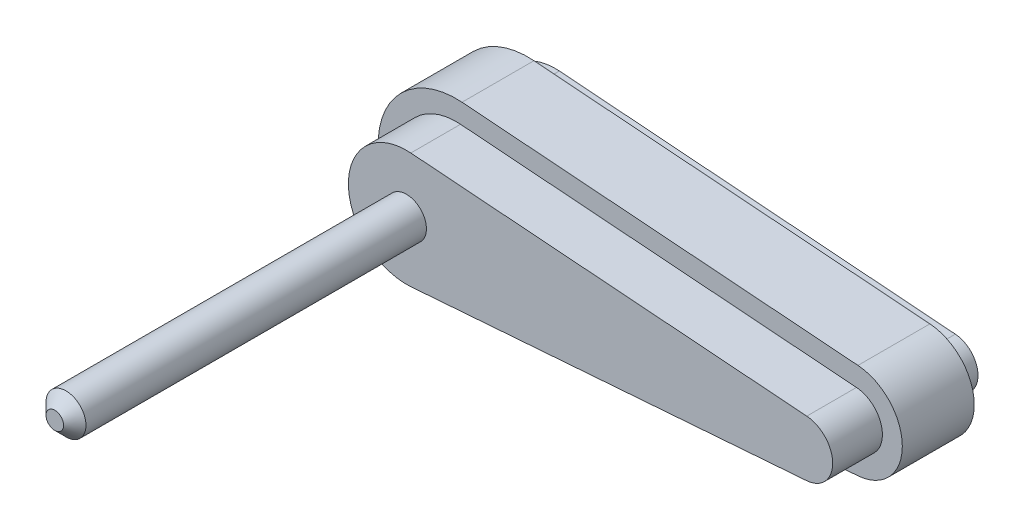
ISO-10303-21;
HEADER;
FILE_DESCRIPTION(('STEP AP214'),'2;1');
FILE_NAME('part.step','',(''),(''),'','','');
FILE_SCHEMA(('AUTOMOTIVE_DESIGN { 1 0 10303 214 1 1 1 1 }'));
ENDSEC;
DATA;
#1=APPLICATION_CONTEXT('core data for automotive mechanical design processes');
#2=APPLICATION_PROTOCOL_DEFINITION('international standard','automotive_design',2000,#1);
#3=PRODUCT_CONTEXT('',#1,'mechanical');
#4=PRODUCT('Part','Part','',(#3));
#5=PRODUCT_RELATED_PRODUCT_CATEGORY('part','',(#4));
#6=PRODUCT_DEFINITION_FORMATION('','',#4);
#7=PRODUCT_DEFINITION_CONTEXT('part definition',#1,'design');
#8=PRODUCT_DEFINITION('design','',#6,#7);
#9=PRODUCT_DEFINITION_SHAPE('','',#8);
#10=(LENGTH_UNIT() NAMED_UNIT(*) SI_UNIT(.MILLI.,.METRE.));
#11=(NAMED_UNIT(*) PLANE_ANGLE_UNIT() SI_UNIT($,.RADIAN.));
#12=(NAMED_UNIT(*) SI_UNIT($,.STERADIAN.) SOLID_ANGLE_UNIT());
#13=UNCERTAINTY_MEASURE_WITH_UNIT(LENGTH_MEASURE(1.E-05),#10,'distance_accuracy_value','');
#14=(GEOMETRIC_REPRESENTATION_CONTEXT(3) GLOBAL_UNCERTAINTY_ASSIGNED_CONTEXT((#13)) GLOBAL_UNIT_ASSIGNED_CONTEXT((#10,
#11,#12)) REPRESENTATION_CONTEXT('',''));
#15=CARTESIAN_POINT('',(0.,0.,0.));
#16=DIRECTION('',(0.,0.,1.));
#17=DIRECTION('',(1.,0.,0.));
#18=AXIS2_PLACEMENT_3D('',#15,#16,#17);
#19=CARTESIAN_POINT('',(0.,0.,-23.6474));
#20=DIRECTION('',(0.,0.,1.));
#21=DIRECTION('',(1.,0.,0.));
#22=AXIS2_PLACEMENT_3D('',#19,#20,#21);
#23=CYLINDRICAL_SURFACE('',#22,9.22655);
#24=DIRECTION('',(0.,0.,1.));
#25=VECTOR('',#24,1.);
#26=CARTESIAN_POINT('',(0.695350686279332,9.20031044723986,-23.6474));
#27=LINE('',#26,#25);
#28=CARTESIAN_POINT('',(0.695350686279328,9.20031044723986,-7.8994));
#29=VERTEX_POINT('',#28);
#30=CARTESIAN_POINT('',(0.695350686279332,9.20031044723986,0.));
#31=VERTEX_POINT('',#30);
#32=EDGE_CURVE('E220',#29,#31,#27,.T.);
#33=ORIENTED_EDGE('',*,*,#32,.F.);
#34=CARTESIAN_POINT('',(0.,0.,-7.8994));
#35=DIRECTION('',(0.,0.,-1.));
#36=DIRECTION('',(-1.,0.,0.));
#37=AXIS2_PLACEMENT_3D('',#34,#35,#36);
#38=CIRCLE('',#37,9.22655);
#39=CARTESIAN_POINT('',(0.69535068627933,-9.20031044723986,-7.8994));
#40=VERTEX_POINT('',#39);
#41=EDGE_CURVE('E192',#40,#29,#38,.T.);
#42=ORIENTED_EDGE('',*,*,#41,.F.);
#43=DIRECTION('',(0.,0.,1.));
#44=VECTOR('',#43,1.);
#45=CARTESIAN_POINT('',(0.695350686279332,-9.20031044723986,-23.6474));
#46=LINE('',#45,#44);
#47=CARTESIAN_POINT('',(0.695350686279332,-9.20031044723986,0.));
#48=VERTEX_POINT('',#47);
#49=EDGE_CURVE('E219',#40,#48,#46,.T.);
#50=ORIENTED_EDGE('',*,*,#49,.T.);
#51=CARTESIAN_POINT('',(0.,0.,0.));
#52=DIRECTION('',(0.,0.,1.));
#53=DIRECTION('',(1.,0.,0.));
#54=AXIS2_PLACEMENT_3D('',#51,#52,#53);
#55=CIRCLE('',#54,9.22655);
#56=EDGE_CURVE('E207',#31,#48,#55,.T.);
#57=ORIENTED_EDGE('',*,*,#56,.F.);
#58=EDGE_LOOP('',(#33,#42,#50,#57));
#59=FACE_BOUND('',#58,.T.);
#60=ADVANCED_FACE('F37',(#59),#23,.T.);
#61=CARTESIAN_POINT('',(0.695350686279332,9.20031044723986,-23.6474));
#62=DIRECTION('',(0.0753641053567512,0.997156081876742,0.));
#63=DIRECTION('',(-0.997156081876742,0.0753641053567512,0.));
#64=AXIS2_PLACEMENT_3D('',#61,#62,#63);
#65=PLANE('',#64);
#66=DIRECTION('',(0.,0.,1.));
#67=VECTOR('',#66,1.);
#68=CARTESIAN_POINT('',(63.6137215901869,4.445,-23.6474));
#69=LINE('',#68,#67);
#70=CARTESIAN_POINT('',(63.6137215901869,4.445,-7.8994));
#71=VERTEX_POINT('',#70);
#72=CARTESIAN_POINT('',(63.6137215901869,4.445,0.));
#73=VERTEX_POINT('',#72);
#74=EDGE_CURVE('E222',#71,#73,#69,.T.);
#75=ORIENTED_EDGE('',*,*,#74,.F.);
#76=DIRECTION('',(0.997156081876742,-0.0753641053567512,0.));
#77=VECTOR('',#76,1.);
#78=CARTESIAN_POINT('',(0.695350686279328,9.20031044723986,-7.8994));
#79=LINE('',#78,#77);
#80=EDGE_CURVE('E198',#29,#71,#79,.T.);
#81=ORIENTED_EDGE('',*,*,#80,.F.);
#82=ORIENTED_EDGE('',*,*,#32,.T.);
#83=DIRECTION('',(-0.997156081876742,0.0753641053567512,0.));
#84=VECTOR('',#83,1.);
#85=CARTESIAN_POINT('',(0.695350686279332,9.20031044723986,0.));
#86=LINE('',#85,#84);
#87=EDGE_CURVE('E216',#73,#31,#86,.T.);
#88=ORIENTED_EDGE('',*,*,#87,.F.);
#89=EDGE_LOOP('',(#75,#81,#82,#88));
#90=FACE_BOUND('',#89,.T.);
#91=ADVANCED_FACE('F240',(#90),#65,.T.);
#92=CARTESIAN_POINT('',(63.2777727308265,0.,-23.6474));
#93=DIRECTION('',(0.,0.,1.));
#94=DIRECTION('',(1.,0.,0.));
#95=AXIS2_PLACEMENT_3D('',#92,#93,#94);
#96=CYLINDRICAL_SURFACE('',#95,4.45767726917343);
#97=DIRECTION('',(0.,0.,1.));
#98=VECTOR('',#97,1.);
#99=CARTESIAN_POINT('',(63.6137215901869,-4.445,-23.6474));
#100=LINE('',#99,#98);
#101=CARTESIAN_POINT('',(63.6137215901869,-4.445,-7.8994));
#102=VERTEX_POINT('',#101);
#103=CARTESIAN_POINT('',(63.6137215901869,-4.445,0.));
#104=VERTEX_POINT('',#103);
#105=EDGE_CURVE('E224',#102,#104,#100,.T.);
#106=ORIENTED_EDGE('',*,*,#105,.F.);
#107=CARTESIAN_POINT('',(63.2777727308265,0.,-7.8994));
#108=DIRECTION('',(0.,0.,-1.));
#109=DIRECTION('',(-1.,0.,0.));
#110=AXIS2_PLACEMENT_3D('',#107,#108,#109);
#111=CIRCLE('',#110,4.45767726917343);
#112=EDGE_CURVE('E201',#71,#102,#111,.T.);
#113=ORIENTED_EDGE('',*,*,#112,.F.);
#114=ORIENTED_EDGE('',*,*,#74,.T.);
#115=CARTESIAN_POINT('',(63.2777727308265,0.,0.));
#116=DIRECTION('',(0.,0.,1.));
#117=DIRECTION('',(-1.,0.,0.));
#118=AXIS2_PLACEMENT_3D('',#115,#116,#117);
#119=CIRCLE('',#118,4.45767726917343);
#120=EDGE_CURVE('E213',#104,#73,#119,.T.);
#121=ORIENTED_EDGE('',*,*,#120,.F.);
#122=EDGE_LOOP('',(#106,#113,#114,#121));
#123=FACE_BOUND('',#122,.T.);
#124=ADVANCED_FACE('F245',(#123),#96,.T.);
#125=CARTESIAN_POINT('',(0.695350686279332,-9.20031044723986,-23.6474));
#126=DIRECTION('',(0.0753641053567512,-0.997156081876742,0.));
#127=DIRECTION('',(0.997156081876742,0.0753641053567512,0.));
#128=AXIS2_PLACEMENT_3D('',#125,#126,#127);
#129=PLANE('',#128);
#130=ORIENTED_EDGE('',*,*,#49,.F.);
#131=DIRECTION('',(-0.997156081876742,-0.0753641053567512,0.));
#132=VECTOR('',#131,1.);
#133=CARTESIAN_POINT('',(63.6137215901869,-4.445,-7.8994));
#134=LINE('',#133,#132);
#135=EDGE_CURVE('E204',#102,#40,#134,.T.);
#136=ORIENTED_EDGE('',*,*,#135,.F.);
#137=ORIENTED_EDGE('',*,*,#105,.T.);
#138=DIRECTION('',(0.997156081876742,0.0753641053567512,0.));
#139=VECTOR('',#138,1.);
#140=CARTESIAN_POINT('',(0.695350686279332,-9.20031044723986,0.));
#141=LINE('',#140,#139);
#142=EDGE_CURVE('E210',#48,#104,#141,.T.);
#143=ORIENTED_EDGE('',*,*,#142,.F.);
#144=EDGE_LOOP('',(#130,#136,#137,#143));
#145=FACE_BOUND('',#144,.T.);
#146=ADVANCED_FACE('F250',(#145),#129,.T.);
#147=CARTESIAN_POINT('',(0.,0.,0.));
#148=DIRECTION('',(0.,0.,1.));
#149=DIRECTION('',(1.,0.,0.));
#150=AXIS2_PLACEMENT_3D('',#147,#148,#149);
#151=PLANE('',#150);
#152=CARTESIAN_POINT('',(0.,0.,0.));
#153=DIRECTION('',(0.,0.,1.));
#154=DIRECTION('',(1.,0.,0.));
#155=AXIS2_PLACEMENT_3D('',#152,#153,#154);
#156=CIRCLE('',#155,3.175);
#157=CARTESIAN_POINT('',(3.175,0.,0.));
#158=VERTEX_POINT('',#157);
#159=EDGE_CURVE('E180',#158,#158,#156,.T.);
#160=ORIENTED_EDGE('',*,*,#159,.F.);
#161=EDGE_LOOP('',(#160));
#162=FACE_BOUND('',#161,.T.);
#163=ORIENTED_EDGE('',*,*,#56,.T.);
#164=ORIENTED_EDGE('',*,*,#142,.T.);
#165=ORIENTED_EDGE('',*,*,#120,.T.);
#166=ORIENTED_EDGE('',*,*,#87,.T.);
#167=EDGE_LOOP('',(#163,#164,#165,#166));
#168=FACE_BOUND('',#167,.T.);
#169=ADVANCED_FACE('F253',(#162,#168),#151,.T.);
#170=CARTESIAN_POINT('',(0.,0.,55.88));
#171=DIRECTION('',(0.,0.,-1.));
#172=DIRECTION('',(-1.,0.,0.));
#173=AXIS2_PLACEMENT_3D('',#170,#171,#172);
#174=CYLINDRICAL_SURFACE('',#173,3.175);
#175=CARTESIAN_POINT('',(0.,0.,54.102));
#176=DIRECTION('',(0.,0.,1.));
#177=DIRECTION('',(1.,0.,0.));
#178=AXIS2_PLACEMENT_3D('',#175,#176,#177);
#179=CIRCLE('',#178,3.175);
#180=CARTESIAN_POINT('',(3.175,0.,54.102));
#181=VERTEX_POINT('',#180);
#182=EDGE_CURVE('E11',#181,#181,#179,.F.);
#183=ORIENTED_EDGE('',*,*,#182,.T.);
#184=EDGE_LOOP('',(#183));
#185=FACE_BOUND('',#184,.T.);
#186=ORIENTED_EDGE('',*,*,#159,.T.);
#187=EDGE_LOOP('',(#186));
#188=FACE_BOUND('',#187,.T.);
#189=ADVANCED_FACE('F260',(#185,#188),#174,.T.);
#190=CARTESIAN_POINT('',(0.,0.,55.88));
#191=DIRECTION('',(0.,0.,1.));
#192=DIRECTION('',(1.,0.,0.));
#193=AXIS2_PLACEMENT_3D('',#190,#191,#192);
#194=PLANE('',#193);
#195=CARTESIAN_POINT('',(0.,0.,55.88));
#196=DIRECTION('',(0.,0.,1.));
#197=DIRECTION('',(1.,0.,0.));
#198=AXIS2_PLACEMENT_3D('',#195,#196,#197);
#199=CIRCLE('',#198,1.39699999999998);
#200=CARTESIAN_POINT('',(1.39699999999998,0.,55.88));
#201=VERTEX_POINT('',#200);
#202=EDGE_CURVE('E45',#201,#201,#199,.T.);
#203=ORIENTED_EDGE('',*,*,#202,.T.);
#204=EDGE_LOOP('',(#203));
#205=FACE_BOUND('',#204,.T.);
#206=ADVANCED_FACE('F229',(#205),#194,.T.);
#207=CARTESIAN_POINT('',(0.,0.,-19.3294));
#208=DIRECTION('',(0.,0.,-1.));
#209=DIRECTION('',(-1.,0.,0.));
#210=AXIS2_PLACEMENT_3D('',#207,#208,#209);
#211=PLANE('',#210);
#212=CARTESIAN_POINT('',(0.,0.,-19.3294));
#213=DIRECTION('',(0.,0.,-1.));
#214=DIRECTION('',(-1.,0.,0.));
#215=AXIS2_PLACEMENT_3D('',#212,#213,#214);
#216=CIRCLE('',#215,12.38885);
#217=CARTESIAN_POINT('',(0.933674596649023,-12.3536171249587,-19.3294));
#218=VERTEX_POINT('',#217);
#219=CARTESIAN_POINT('',(0.933674596648987,12.3536171249587,-19.3294));
#220=VERTEX_POINT('',#219);
#221=EDGE_CURVE('E151',#218,#220,#216,.T.);
#222=ORIENTED_EDGE('',*,*,#221,.T.);
#223=DIRECTION('',(0.997156081876742,-0.0753641053567512,0.));
#224=VECTOR('',#223,1.);
#225=CARTESIAN_POINT('',(0.933674596648987,12.3536171249587,-19.3294));
#226=LINE('',#225,#224);
#227=CARTESIAN_POINT('',(63.8520455005565,7.59830667771882,-19.3294));
#228=VERTEX_POINT('',#227);
#229=EDGE_CURVE('E154',#220,#228,#226,.T.);
#230=ORIENTED_EDGE('',*,*,#229,.T.);
#231=CARTESIAN_POINT('',(63.2777727308265,0.,-19.3294));
#232=DIRECTION('',(0.,0.,-1.));
#233=DIRECTION('',(-1.,0.,0.));
#234=AXIS2_PLACEMENT_3D('',#231,#232,#233);
#235=CIRCLE('',#234,7.61997726917343);
#236=CARTESIAN_POINT('',(63.8520455005566,-7.59830667771882,-19.3294));
#237=VERTEX_POINT('',#236);
#238=EDGE_CURVE('E157',#228,#237,#235,.T.);
#239=ORIENTED_EDGE('',*,*,#238,.T.);
#240=DIRECTION('',(-0.997156081876742,-0.0753641053567512,0.));
#241=VECTOR('',#240,1.);
#242=CARTESIAN_POINT('',(63.8520455005566,-7.59830667771882,-19.3294));
#243=LINE('',#242,#241);
#244=EDGE_CURVE('E159',#237,#218,#243,.T.);
#245=ORIENTED_EDGE('',*,*,#244,.T.);
#246=EDGE_LOOP('',(#222,#230,#239,#245));
#247=FACE_BOUND('',#246,.T.);
#248=DIRECTION('',(0.997156081876742,-0.0753641053567512,0.));
#249=VECTOR('',#248,1.);
#250=CARTESIAN_POINT('',(0.653237224205975,8.64309962868714,-19.3294));
#251=LINE('',#250,#249);
#252=CARTESIAN_POINT('',(0.653237224205975,8.64309962868714,-19.3294));
#253=VERTEX_POINT('',#252);
#254=CARTESIAN_POINT('',(63.5716081281136,3.88778918144728,-19.3294));
#255=VERTEX_POINT('',#254);
#256=EDGE_CURVE('E130',#253,#255,#251,.T.);
#257=ORIENTED_EDGE('',*,*,#256,.F.);
#258=CARTESIAN_POINT('',(0.,0.,-19.3294));
#259=DIRECTION('',(0.,0.,-1.));
#260=DIRECTION('',(-1.,0.,0.));
#261=AXIS2_PLACEMENT_3D('',#258,#259,#260);
#262=CIRCLE('',#261,8.66775000000001);
#263=CARTESIAN_POINT('',(0.653237224205998,-8.64309962868714,-19.3294));
#264=VERTEX_POINT('',#263);
#265=EDGE_CURVE('E140',#264,#253,#262,.T.);
#266=ORIENTED_EDGE('',*,*,#265,.F.);
#267=DIRECTION('',(-0.997156081876742,-0.0753641053567512,0.));
#268=VECTOR('',#267,1.);
#269=CARTESIAN_POINT('',(63.5716081281136,-3.88778918144727,-19.3294));
#270=LINE('',#269,#268);
#271=CARTESIAN_POINT('',(63.5716081281136,-3.88778918144728,-19.3294));
#272=VERTEX_POINT('',#271);
#273=EDGE_CURVE('E52',#272,#264,#270,.T.);
#274=ORIENTED_EDGE('',*,*,#273,.F.);
#275=CARTESIAN_POINT('',(63.2777727308265,0.,-19.3294));
#276=DIRECTION('',(0.,0.,-1.));
#277=DIRECTION('',(-1.,0.,0.));
#278=AXIS2_PLACEMENT_3D('',#275,#276,#277);
#279=CIRCLE('',#278,3.89887726917343);
#280=EDGE_CURVE('E60',#255,#272,#279,.T.);
#281=ORIENTED_EDGE('',*,*,#280,.F.);
#282=EDGE_LOOP('',(#257,#266,#274,#281));
#283=FACE_BOUND('',#282,.T.);
#284=ADVANCED_FACE('F145',(#247,#283),#211,.T.);
#285=CARTESIAN_POINT('',(0.,0.,-7.8994));
#286=DIRECTION('',(0.,0.,-1.));
#287=DIRECTION('',(-1.,0.,0.));
#288=AXIS2_PLACEMENT_3D('',#285,#286,#287);
#289=PLANE('',#288);
#290=ORIENTED_EDGE('',*,*,#41,.T.);
#291=ORIENTED_EDGE('',*,*,#80,.T.);
#292=ORIENTED_EDGE('',*,*,#112,.T.);
#293=ORIENTED_EDGE('',*,*,#135,.T.);
#294=EDGE_LOOP('',(#290,#291,#292,#293));
#295=FACE_BOUND('',#294,.T.);
#296=CARTESIAN_POINT('',(0.,0.,-7.8994));
#297=DIRECTION('',(0.,0.,-1.));
#298=DIRECTION('',(-1.,0.,0.));
#299=AXIS2_PLACEMENT_3D('',#296,#297,#298);
#300=CIRCLE('',#299,12.38885);
#301=CARTESIAN_POINT('',(0.933674596649023,-12.3536171249587,-7.8994));
#302=VERTEX_POINT('',#301);
#303=CARTESIAN_POINT('',(0.933674596648987,12.3536171249587,-7.8994));
#304=VERTEX_POINT('',#303);
#305=EDGE_CURVE('E150',#302,#304,#300,.T.);
#306=ORIENTED_EDGE('',*,*,#305,.F.);
#307=DIRECTION('',(-0.997156081876742,-0.0753641053567512,0.));
#308=VECTOR('',#307,1.);
#309=CARTESIAN_POINT('',(63.8520455005566,-7.59830667771882,-7.8994));
#310=LINE('',#309,#308);
#311=CARTESIAN_POINT('',(63.8520455005566,-7.59830667771882,-7.8994));
#312=VERTEX_POINT('',#311);
#313=EDGE_CURVE('E155',#312,#302,#310,.T.);
#314=ORIENTED_EDGE('',*,*,#313,.F.);
#315=CARTESIAN_POINT('',(63.2777727308265,0.,-7.8994));
#316=DIRECTION('',(0.,0.,-1.));
#317=DIRECTION('',(-1.,0.,0.));
#318=AXIS2_PLACEMENT_3D('',#315,#316,#317);
#319=CIRCLE('',#318,7.61997726917343);
#320=CARTESIAN_POINT('',(63.8520455005565,7.59830667771882,-7.8994));
#321=VERTEX_POINT('',#320);
#322=EDGE_CURVE('E166',#321,#312,#319,.T.);
#323=ORIENTED_EDGE('',*,*,#322,.F.);
#324=DIRECTION('',(0.997156081876742,-0.0753641053567512,0.));
#325=VECTOR('',#324,1.);
#326=CARTESIAN_POINT('',(0.933674596648987,12.3536171249587,-7.8994));
#327=LINE('',#326,#325);
#328=EDGE_CURVE('E164',#304,#321,#327,.T.);
#329=ORIENTED_EDGE('',*,*,#328,.F.);
#330=EDGE_LOOP('',(#306,#314,#323,#329));
#331=FACE_BOUND('',#330,.T.);
#332=ADVANCED_FACE('F283',(#295,#331),#289,.F.);
#333=CARTESIAN_POINT('',(0.,0.,-19.3294));
#334=DIRECTION('',(0.,0.,1.));
#335=DIRECTION('',(1.,0.,0.));
#336=AXIS2_PLACEMENT_3D('',#333,#334,#335);
#337=CYLINDRICAL_SURFACE('',#336,12.38885);
#338=ORIENTED_EDGE('',*,*,#305,.T.);
#339=DIRECTION('',(0.,0.,1.));
#340=VECTOR('',#339,1.);
#341=CARTESIAN_POINT('',(0.933674596648987,12.3536171249587,-19.3294));
#342=LINE('',#341,#340);
#343=EDGE_CURVE('E177',#220,#304,#342,.T.);
#344=ORIENTED_EDGE('',*,*,#343,.F.);
#345=ORIENTED_EDGE('',*,*,#221,.F.);
#346=DIRECTION('',(0.,0.,1.));
#347=VECTOR('',#346,1.);
#348=CARTESIAN_POINT('',(0.933674596649023,-12.3536171249587,-19.3294));
#349=LINE('',#348,#347);
#350=EDGE_CURVE('E161',#218,#302,#349,.T.);
#351=ORIENTED_EDGE('',*,*,#350,.T.);
#352=EDGE_LOOP('',(#338,#344,#345,#351));
#353=FACE_BOUND('',#352,.T.);
#354=ADVANCED_FACE('F279',(#353),#337,.T.);
#355=CARTESIAN_POINT('',(0.933674596648987,12.3536171249587,-19.3294));
#356=DIRECTION('',(-0.0753641053567512,-0.997156081876742,0.));
#357=DIRECTION('',(0.997156081876742,-0.0753641053567512,0.));
#358=AXIS2_PLACEMENT_3D('',#355,#356,#357);
#359=PLANE('',#358);
#360=ORIENTED_EDGE('',*,*,#328,.T.);
#361=DIRECTION('',(0.,0.,1.));
#362=VECTOR('',#361,1.);
#363=CARTESIAN_POINT('',(63.8520455005565,7.59830667771882,-19.3294));
#364=LINE('',#363,#362);
#365=EDGE_CURVE('E174',#228,#321,#364,.T.);
#366=ORIENTED_EDGE('',*,*,#365,.F.);
#367=ORIENTED_EDGE('',*,*,#229,.F.);
#368=ORIENTED_EDGE('',*,*,#343,.T.);
#369=EDGE_LOOP('',(#360,#366,#367,#368));
#370=FACE_BOUND('',#369,.T.);
#371=ADVANCED_FACE('F282',(#370),#359,.F.);
#372=CARTESIAN_POINT('',(63.2777727308265,0.,-19.3294));
#373=DIRECTION('',(0.,0.,1.));
#374=DIRECTION('',(1.,0.,0.));
#375=AXIS2_PLACEMENT_3D('',#372,#373,#374);
#376=CYLINDRICAL_SURFACE('',#375,7.61997726917343);
#377=ORIENTED_EDGE('',*,*,#322,.T.);
#378=DIRECTION('',(0.,0.,1.));
#379=VECTOR('',#378,1.);
#380=CARTESIAN_POINT('',(63.8520455005566,-7.59830667771882,-19.3294));
#381=LINE('',#380,#379);
#382=EDGE_CURVE('E171',#237,#312,#381,.T.);
#383=ORIENTED_EDGE('',*,*,#382,.F.);
#384=ORIENTED_EDGE('',*,*,#238,.F.);
#385=ORIENTED_EDGE('',*,*,#365,.T.);
#386=EDGE_LOOP('',(#377,#383,#384,#385));
#387=FACE_BOUND('',#386,.T.);
#388=ADVANCED_FACE('F287',(#387),#376,.T.);
#389=CARTESIAN_POINT('',(63.8520455005566,-7.59830667771882,-19.3294));
#390=DIRECTION('',(-0.0753641053567512,0.997156081876742,0.));
#391=DIRECTION('',(-0.997156081876742,-0.0753641053567512,0.));
#392=AXIS2_PLACEMENT_3D('',#389,#390,#391);
#393=PLANE('',#392);
#394=ORIENTED_EDGE('',*,*,#313,.T.);
#395=ORIENTED_EDGE('',*,*,#350,.F.);
#396=ORIENTED_EDGE('',*,*,#244,.F.);
#397=ORIENTED_EDGE('',*,*,#382,.T.);
#398=EDGE_LOOP('',(#394,#395,#396,#397));
#399=FACE_BOUND('',#398,.T.);
#400=ADVANCED_FACE('F264',(#399),#393,.F.);
#401=CARTESIAN_POINT('',(0.,0.,-23.6474));
#402=DIRECTION('',(0.,0.,1.));
#403=DIRECTION('',(1.,0.,0.));
#404=AXIS2_PLACEMENT_3D('',#401,#402,#403);
#405=PLANE('',#404);
#406=CARTESIAN_POINT('',(0.,0.,-23.6474));
#407=DIRECTION('',(0.,0.,-1.));
#408=DIRECTION('',(-1.,0.,0.));
#409=AXIS2_PLACEMENT_3D('',#406,#407,#408);
#410=CIRCLE('',#409,8.66775000000001);
#411=CARTESIAN_POINT('',(0.653237224205998,-8.64309962868714,-23.6474));
#412=VERTEX_POINT('',#411);
#413=CARTESIAN_POINT('',(0.65323722420598,8.64309962868714,-23.6474));
#414=VERTEX_POINT('',#413);
#415=EDGE_CURVE('E183',#412,#414,#410,.T.);
#416=ORIENTED_EDGE('',*,*,#415,.T.);
#417=DIRECTION('',(0.997156081876742,-0.0753641053567512,0.));
#418=VECTOR('',#417,1.);
#419=CARTESIAN_POINT('',(0.65323722420598,8.64309962868714,-23.6474));
#420=LINE('',#419,#418);
#421=CARTESIAN_POINT('',(63.5716081281136,3.88778918144727,-23.6474));
#422=VERTEX_POINT('',#421);
#423=EDGE_CURVE('E132',#414,#422,#420,.T.);
#424=ORIENTED_EDGE('',*,*,#423,.T.);
#425=CARTESIAN_POINT('',(63.2777727308265,0.,-23.6474));
#426=DIRECTION('',(0.,0.,-1.));
#427=DIRECTION('',(-1.,0.,0.));
#428=AXIS2_PLACEMENT_3D('',#425,#426,#427);
#429=CIRCLE('',#428,3.89887726917343);
#430=CARTESIAN_POINT('',(63.5716081281136,-3.88778918144728,-23.6474));
#431=VERTEX_POINT('',#430);
#432=EDGE_CURVE('E186',#422,#431,#429,.T.);
#433=ORIENTED_EDGE('',*,*,#432,.T.);
#434=DIRECTION('',(-0.997156081876742,-0.0753641053567512,0.));
#435=VECTOR('',#434,1.);
#436=CARTESIAN_POINT('',(63.5716081281136,-3.88778918144728,-23.6474));
#437=LINE('',#436,#435);
#438=EDGE_CURVE('E137',#431,#412,#437,.T.);
#439=ORIENTED_EDGE('',*,*,#438,.T.);
#440=EDGE_LOOP('',(#416,#424,#433,#439));
#441=FACE_BOUND('',#440,.T.);
#442=ADVANCED_FACE('F262',(#441),#405,.F.);
#443=CARTESIAN_POINT('',(0.65323722420598,8.64309962868714,-7.8994));
#444=DIRECTION('',(0.0753641053567512,0.997156081876742,0.));
#445=DIRECTION('',(-0.997156081876742,0.0753641053567512,0.));
#446=AXIS2_PLACEMENT_3D('',#443,#444,#445);
#447=PLANE('',#446);
#448=ORIENTED_EDGE('',*,*,#256,.T.);
#449=DIRECTION('',(0.,0.,-1.));
#450=VECTOR('',#449,1.);
#451=CARTESIAN_POINT('',(63.5716081281136,3.88778918144728,-7.8994));
#452=LINE('',#451,#450);
#453=EDGE_CURVE('E136',#255,#422,#452,.T.);
#454=ORIENTED_EDGE('',*,*,#453,.T.);
#455=ORIENTED_EDGE('',*,*,#423,.F.);
#456=DIRECTION('',(0.,0.,-1.));
#457=VECTOR('',#456,1.);
#458=CARTESIAN_POINT('',(0.65323722420598,8.64309962868714,-7.8994));
#459=LINE('',#458,#457);
#460=EDGE_CURVE('E126',#253,#414,#459,.T.);
#461=ORIENTED_EDGE('',*,*,#460,.F.);
#462=EDGE_LOOP('',(#448,#454,#455,#461));
#463=FACE_BOUND('',#462,.T.);
#464=ADVANCED_FACE('F128',(#463),#447,.T.);
#465=CARTESIAN_POINT('',(63.2777727308265,0.,-7.8994));
#466=DIRECTION('',(0.,0.,-1.));
#467=DIRECTION('',(-1.,0.,0.));
#468=AXIS2_PLACEMENT_3D('',#465,#466,#467);
#469=CYLINDRICAL_SURFACE('',#468,3.89887726917343);
#470=ORIENTED_EDGE('',*,*,#280,.T.);
#471=DIRECTION('',(0.,0.,-1.));
#472=VECTOR('',#471,1.);
#473=CARTESIAN_POINT('',(63.5716081281136,-3.88778918144728,-7.8994));
#474=LINE('',#473,#472);
#475=EDGE_CURVE('E193',#272,#431,#474,.T.);
#476=ORIENTED_EDGE('',*,*,#475,.T.);
#477=ORIENTED_EDGE('',*,*,#432,.F.);
#478=ORIENTED_EDGE('',*,*,#453,.F.);
#479=EDGE_LOOP('',(#470,#476,#477,#478));
#480=FACE_BOUND('',#479,.T.);
#481=ADVANCED_FACE('F269',(#480),#469,.T.);
#482=CARTESIAN_POINT('',(63.5716081281136,-3.88778918144728,-7.8994));
#483=DIRECTION('',(0.0753641053567513,-0.997156081876742,0.));
#484=DIRECTION('',(0.997156081876742,0.0753641053567513,0.));
#485=AXIS2_PLACEMENT_3D('',#482,#483,#484);
#486=PLANE('',#485);
#487=ORIENTED_EDGE('',*,*,#273,.T.);
#488=DIRECTION('',(0.,0.,-1.));
#489=VECTOR('',#488,1.);
#490=CARTESIAN_POINT('',(0.653237224205998,-8.64309962868714,-7.8994));
#491=LINE('',#490,#489);
#492=EDGE_CURVE('E142',#264,#412,#491,.T.);
#493=ORIENTED_EDGE('',*,*,#492,.T.);
#494=ORIENTED_EDGE('',*,*,#438,.F.);
#495=ORIENTED_EDGE('',*,*,#475,.F.);
#496=EDGE_LOOP('',(#487,#493,#494,#495));
#497=FACE_BOUND('',#496,.T.);
#498=ADVANCED_FACE('F236',(#497),#486,.T.);
#499=CARTESIAN_POINT('',(0.,0.,-7.8994));
#500=DIRECTION('',(0.,0.,-1.));
#501=DIRECTION('',(-1.,0.,0.));
#502=AXIS2_PLACEMENT_3D('',#499,#500,#501);
#503=CYLINDRICAL_SURFACE('',#502,8.66775000000001);
#504=ORIENTED_EDGE('',*,*,#265,.T.);
#505=ORIENTED_EDGE('',*,*,#460,.T.);
#506=ORIENTED_EDGE('',*,*,#415,.F.);
#507=ORIENTED_EDGE('',*,*,#492,.F.);
#508=EDGE_LOOP('',(#504,#505,#506,#507));
#509=FACE_BOUND('',#508,.T.);
#510=ADVANCED_FACE('F141',(#509),#503,.T.);
#511=CARTESIAN_POINT('',(0.,0.,55.88));
#512=DIRECTION('',(0.,0.,-1.));
#513=DIRECTION('',(-1.,0.,0.));
#514=AXIS2_PLACEMENT_3D('',#511,#512,#513);
#515=CONICAL_SURFACE('',#514,1.39699999999998,0.785398163397445);
#516=ORIENTED_EDGE('',*,*,#182,.F.);
#517=EDGE_LOOP('',(#516));
#518=FACE_BOUND('',#517,.T.);
#519=ORIENTED_EDGE('',*,*,#202,.F.);
#520=EDGE_LOOP('',(#519));
#521=FACE_BOUND('',#520,.T.);
#522=ADVANCED_FACE('F39',(#518,#521),#515,.T.);
#523=CLOSED_SHELL('',(#60,#91,#124,#146,#169,#189,#206,#284,#332,#354,#371,#388,#400,#442,#464,
#481,#498,#510,#522));
#524=MANIFOLD_SOLID_BREP('B2',#523);
#525=ADVANCED_BREP_SHAPE_REPRESENTATION('',(#18,#524),#14);
#526=SHAPE_DEFINITION_REPRESENTATION(#9,#525);
ENDSEC;
END-ISO-10303-21;
